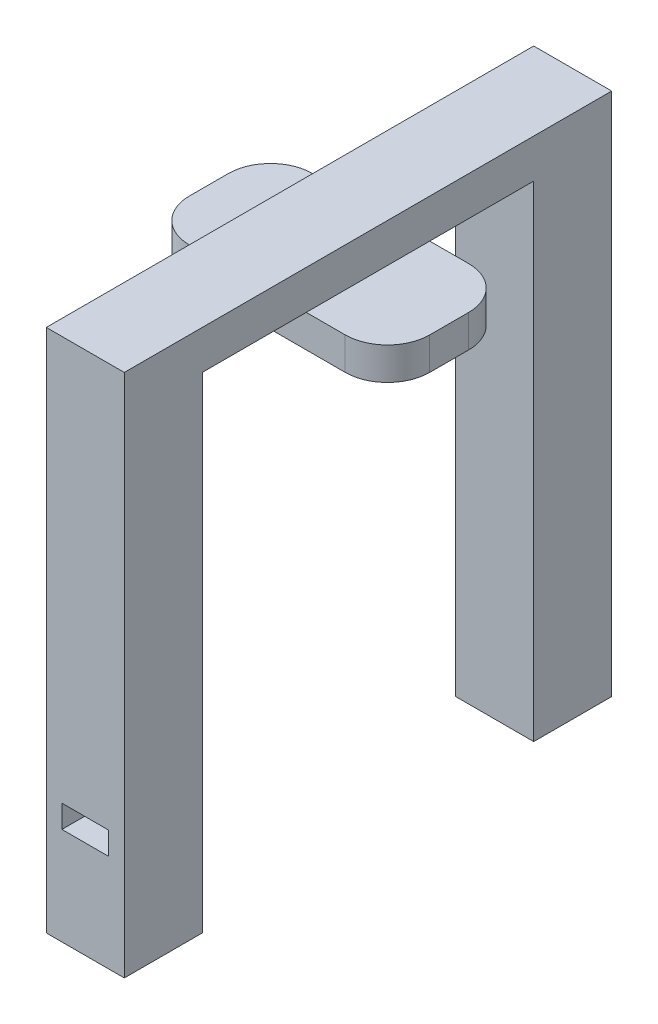
ISO-10303-21;
HEADER;
FILE_DESCRIPTION(('STEP AP214'),'2;1');
FILE_NAME('part.step','',(''),(''),'','','');
FILE_SCHEMA(('AUTOMOTIVE_DESIGN { 1 0 10303 214 1 1 1 1 }'));
ENDSEC;
DATA;
#1=APPLICATION_CONTEXT('core data for automotive mechanical design processes');
#2=APPLICATION_PROTOCOL_DEFINITION('international standard','automotive_design',2000,#1);
#3=PRODUCT_CONTEXT('',#1,'mechanical');
#4=PRODUCT('Part','Part','',(#3));
#5=PRODUCT_RELATED_PRODUCT_CATEGORY('part','',(#4));
#6=PRODUCT_DEFINITION_FORMATION('','',#4);
#7=PRODUCT_DEFINITION_CONTEXT('part definition',#1,'design');
#8=PRODUCT_DEFINITION('design','',#6,#7);
#9=PRODUCT_DEFINITION_SHAPE('','',#8);
#10=(LENGTH_UNIT() NAMED_UNIT(*) SI_UNIT(.MILLI.,.METRE.));
#11=(NAMED_UNIT(*) PLANE_ANGLE_UNIT() SI_UNIT($,.RADIAN.));
#12=(NAMED_UNIT(*) SI_UNIT($,.STERADIAN.) SOLID_ANGLE_UNIT());
#13=UNCERTAINTY_MEASURE_WITH_UNIT(LENGTH_MEASURE(1.E-05),#10,'distance_accuracy_value','');
#14=(GEOMETRIC_REPRESENTATION_CONTEXT(3) GLOBAL_UNCERTAINTY_ASSIGNED_CONTEXT((#13)) GLOBAL_UNIT_ASSIGNED_CONTEXT((#10,
#11,#12)) REPRESENTATION_CONTEXT('',''));
#15=CARTESIAN_POINT('',(0.,0.,0.));
#16=DIRECTION('',(0.,0.,1.));
#17=DIRECTION('',(1.,0.,0.));
#18=AXIS2_PLACEMENT_3D('',#15,#16,#17);
#19=CARTESIAN_POINT('',(-4.86740694674023,-29.7,-33.4324410330826));
#20=DIRECTION('',(0.,-1.,0.));
#21=DIRECTION('',(0.,0.,-1.));
#22=AXIS2_PLACEMENT_3D('',#19,#20,#21);
#23=CYLINDRICAL_SURFACE('',#22,2.075);
#24=CARTESIAN_POINT('',(-4.86740694674023,-69.7,-33.4324410330826));
#25=DIRECTION('',(0.,-1.,0.));
#26=DIRECTION('',(0.,0.,-1.));
#27=AXIS2_PLACEMENT_3D('',#24,#25,#26);
#28=CIRCLE('',#27,2.075);
#29=CARTESIAN_POINT('',(-4.86740694674023,-69.7,-35.5074410330826));
#30=VERTEX_POINT('',#29);
#31=EDGE_CURVE('E277',#30,#30,#28,.T.);
#32=ORIENTED_EDGE('',*,*,#31,.T.);
#33=EDGE_LOOP('',(#32));
#34=FACE_BOUND('',#33,.T.);
#35=CARTESIAN_POINT('',(-4.86740694674023,-54.7,-33.4324410330826));
#36=DIRECTION('',(0.,1.,0.));
#37=DIRECTION('',(0.,0.,1.));
#38=AXIS2_PLACEMENT_3D('',#35,#36,#37);
#39=CIRCLE('',#38,2.075);
#40=CARTESIAN_POINT('',(-4.86740694674023,-54.7,-31.3574410330826));
#41=VERTEX_POINT('',#40);
#42=EDGE_CURVE('E37',#41,#41,#39,.F.);
#43=ORIENTED_EDGE('',*,*,#42,.F.);
#44=EDGE_LOOP('',(#43));
#45=FACE_BOUND('',#44,.T.);
#46=ADVANCED_FACE('F33',(#34,#45),#23,.F.);
#47=CARTESIAN_POINT('',(-4.86740694674023,-29.7,29.5675589669174));
#48=DIRECTION('',(0.,-1.,0.));
#49=DIRECTION('',(0.,0.,-1.));
#50=AXIS2_PLACEMENT_3D('',#47,#48,#49);
#51=CYLINDRICAL_SURFACE('',#50,2.075);
#52=CARTESIAN_POINT('',(-4.86740694674023,-69.7,29.5675589669174));
#53=DIRECTION('',(0.,-1.,0.));
#54=DIRECTION('',(0.,0.,-1.));
#55=AXIS2_PLACEMENT_3D('',#52,#53,#54);
#56=CIRCLE('',#55,2.075);
#57=CARTESIAN_POINT('',(-4.86740694674023,-69.7,27.4925589669174));
#58=VERTEX_POINT('',#57);
#59=EDGE_CURVE('E280',#58,#58,#56,.T.);
#60=ORIENTED_EDGE('',*,*,#59,.T.);
#61=EDGE_LOOP('',(#60));
#62=FACE_BOUND('',#61,.T.);
#63=CARTESIAN_POINT('',(-4.86740694674023,-54.7,29.5675589669174));
#64=DIRECTION('',(0.,1.,0.));
#65=DIRECTION('',(0.,0.,1.));
#66=AXIS2_PLACEMENT_3D('',#63,#64,#65);
#67=CIRCLE('',#66,2.075);
#68=CARTESIAN_POINT('',(-4.86740694674023,-54.7,31.6425589669174));
#69=VERTEX_POINT('',#68);
#70=EDGE_CURVE('E284',#69,#69,#67,.F.);
#71=ORIENTED_EDGE('',*,*,#70,.F.);
#72=EDGE_LOOP('',(#71));
#73=FACE_BOUND('',#72,.T.);
#74=ADVANCED_FACE('F429',(#62,#73),#51,.F.);
#75=CARTESIAN_POINT('',(0.,5.,0.));
#76=DIRECTION('',(0.,1.,0.));
#77=DIRECTION('',(0.,0.,1.));
#78=AXIS2_PLACEMENT_3D('',#75,#76,#77);
#79=PLANE('',#78);
#80=DIRECTION('',(-1.,0.,0.));
#81=VECTOR('',#80,1.);
#82=CARTESIAN_POINT('',(0.,5.,-27.4324410330826));
#83=LINE('',#82,#81);
#84=CARTESIAN_POINT('',(1.13259305325977,5.,-27.4324410330826));
#85=VERTEX_POINT('',#84);
#86=CARTESIAN_POINT('',(-10.8674069467402,5.,-27.4324410330826));
#87=VERTEX_POINT('',#86);
#88=EDGE_CURVE('E300',#85,#87,#83,.T.);
#89=ORIENTED_EDGE('',*,*,#88,.F.);
#90=DIRECTION('',(0.,0.,-1.));
#91=VECTOR('',#90,1.);
#92=CARTESIAN_POINT('',(1.13259305325977,5.,35.5675589669174));
#93=LINE('',#92,#91);
#94=CARTESIAN_POINT('',(1.13259305325977,5.,-11.4324410330826));
#95=VERTEX_POINT('',#94);
#96=EDGE_CURVE('E330',#95,#85,#93,.T.);
#97=ORIENTED_EDGE('',*,*,#96,.F.);
#98=DIRECTION('',(-1.,0.,0.));
#99=VECTOR('',#98,1.);
#100=CARTESIAN_POINT('',(-23.3674069467402,5.,-11.4324410330826));
#101=LINE('',#100,#99);
#102=CARTESIAN_POINT('',(-10.8674069467402,5.,-11.4324410330826));
#103=VERTEX_POINT('',#102);
#104=EDGE_CURVE('E369',#95,#103,#101,.T.);
#105=ORIENTED_EDGE('',*,*,#104,.T.);
#106=DIRECTION('',(0.,0.,-1.));
#107=VECTOR('',#106,1.);
#108=CARTESIAN_POINT('',(-10.8674069467402,5.,35.5675589669174));
#109=LINE('',#108,#107);
#110=EDGE_CURVE('E45',#103,#87,#109,.T.);
#111=ORIENTED_EDGE('',*,*,#110,.T.);
#112=EDGE_LOOP('',(#89,#97,#105,#111));
#113=FACE_BOUND('',#112,.T.);
#114=ADVANCED_FACE('F437',(#113),#79,.F.);
#115=CARTESIAN_POINT('',(0.,5.,0.));
#116=DIRECTION('',(0.,1.,0.));
#117=DIRECTION('',(0.,0.,1.));
#118=AXIS2_PLACEMENT_3D('',#115,#116,#117);
#119=PLANE('',#118);
#120=DIRECTION('',(1.,0.,0.));
#121=VECTOR('',#120,1.);
#122=CARTESIAN_POINT('',(-23.3674069467402,5.,7.56755896691743));
#123=LINE('',#122,#121);
#124=CARTESIAN_POINT('',(-16.8674069467402,5.,7.56755896691743));
#125=VERTEX_POINT('',#124);
#126=CARTESIAN_POINT('',(-10.8674069467402,5.,7.56755896691743));
#127=VERTEX_POINT('',#126);
#128=EDGE_CURVE('E358',#125,#127,#123,.T.);
#129=ORIENTED_EDGE('',*,*,#128,.T.);
#130=EDGE_CURVE('E11',#127,#103,#109,.T.);
#131=ORIENTED_EDGE('',*,*,#130,.T.);
#132=CARTESIAN_POINT('',(-16.8674069467402,5.,-11.4324410330826));
#133=VERTEX_POINT('',#132);
#134=EDGE_CURVE('E365',#103,#133,#101,.T.);
#135=ORIENTED_EDGE('',*,*,#134,.T.);
#136=CARTESIAN_POINT('',(-16.8674069467402,5.,-4.93244103308257));
#137=DIRECTION('',(0.,1.,0.));
#138=DIRECTION('',(0.,0.,1.));
#139=AXIS2_PLACEMENT_3D('',#136,#137,#138);
#140=CIRCLE('',#139,6.5);
#141=CARTESIAN_POINT('',(-23.3674069467402,5.,-4.93244103308256));
#142=VERTEX_POINT('',#141);
#143=EDGE_CURVE('E404',#133,#142,#140,.T.);
#144=ORIENTED_EDGE('',*,*,#143,.T.);
#145=DIRECTION('',(0.,0.,1.));
#146=VECTOR('',#145,1.);
#147=CARTESIAN_POINT('',(-23.3674069467402,5.,-11.4324410330826));
#148=LINE('',#147,#146);
#149=CARTESIAN_POINT('',(-23.3674069467402,5.,1.06755896691744));
#150=VERTEX_POINT('',#149);
#151=EDGE_CURVE('E353',#142,#150,#148,.T.);
#152=ORIENTED_EDGE('',*,*,#151,.T.);
#153=CARTESIAN_POINT('',(-16.8674069467402,5.,1.06755896691743));
#154=DIRECTION('',(0.,1.,0.));
#155=DIRECTION('',(0.,0.,1.));
#156=AXIS2_PLACEMENT_3D('',#153,#154,#155);
#157=CIRCLE('',#156,6.5);
#158=EDGE_CURVE('E398',#150,#125,#157,.T.);
#159=ORIENTED_EDGE('',*,*,#158,.T.);
#160=EDGE_LOOP('',(#129,#131,#135,#144,#152,#159));
#161=FACE_BOUND('',#160,.T.);
#162=ADVANCED_FACE('F488',(#161),#119,.T.);
#163=CARTESIAN_POINT('',(-23.3674069467402,5.,-11.4324410330826));
#164=DIRECTION('',(1.,0.,0.));
#165=DIRECTION('',(0.,0.,-1.));
#166=AXIS2_PLACEMENT_3D('',#163,#164,#165);
#167=PLANE('',#166);
#168=ORIENTED_EDGE('',*,*,#151,.F.);
#169=DIRECTION('',(0.,-1.,0.));
#170=VECTOR('',#169,1.);
#171=CARTESIAN_POINT('',(-23.3674069467402,5.,-4.93244103308256));
#172=LINE('',#171,#170);
#173=CARTESIAN_POINT('',(-23.3674069467402,0.,-4.93244103308256));
#174=VERTEX_POINT('',#173);
#175=EDGE_CURVE('E381',#142,#174,#172,.T.);
#176=ORIENTED_EDGE('',*,*,#175,.T.);
#177=DIRECTION('',(0.,0.,1.));
#178=VECTOR('',#177,1.);
#179=CARTESIAN_POINT('',(-23.3674069467402,0.,-11.4324410330826));
#180=LINE('',#179,#178);
#181=CARTESIAN_POINT('',(-23.3674069467402,0.,1.06755896691744));
#182=VERTEX_POINT('',#181);
#183=EDGE_CURVE('E352',#174,#182,#180,.T.);
#184=ORIENTED_EDGE('',*,*,#183,.T.);
#185=DIRECTION('',(0.,-1.,0.));
#186=VECTOR('',#185,1.);
#187=CARTESIAN_POINT('',(-23.3674069467402,5.,1.06755896691744));
#188=LINE('',#187,#186);
#189=EDGE_CURVE('E368',#182,#150,#188,.F.);
#190=ORIENTED_EDGE('',*,*,#189,.T.);
#191=EDGE_LOOP('',(#168,#176,#184,#190));
#192=FACE_BOUND('',#191,.T.);
#193=ADVANCED_FACE('F526',(#192),#167,.F.);
#194=CARTESIAN_POINT('',(-23.3674069467402,5.,7.56755896691743));
#195=DIRECTION('',(0.,0.,-1.));
#196=DIRECTION('',(-1.,0.,0.));
#197=AXIS2_PLACEMENT_3D('',#194,#195,#196);
#198=PLANE('',#197);
#199=DIRECTION('',(1.,0.,0.));
#200=VECTOR('',#199,1.);
#201=CARTESIAN_POINT('',(-23.3674069467402,0.,7.56755896691743));
#202=LINE('',#201,#200);
#203=CARTESIAN_POINT('',(-16.8674069467402,0.,7.56755896691743));
#204=VERTEX_POINT('',#203);
#205=CARTESIAN_POINT('',(7.13259305325977,0.,7.56755896691743));
#206=VERTEX_POINT('',#205);
#207=EDGE_CURVE('E372',#204,#206,#202,.T.);
#208=ORIENTED_EDGE('',*,*,#207,.T.);
#209=DIRECTION('',(0.,-1.,0.));
#210=VECTOR('',#209,1.);
#211=CARTESIAN_POINT('',(7.13259305325977,5.,7.56755896691743));
#212=LINE('',#211,#210);
#213=CARTESIAN_POINT('',(7.13259305325977,5.,7.56755896691743));
#214=VERTEX_POINT('',#213);
#215=EDGE_CURVE('E414',#206,#214,#212,.F.);
#216=ORIENTED_EDGE('',*,*,#215,.T.);
#217=CARTESIAN_POINT('',(1.13259305325977,5.,7.56755896691743));
#218=VERTEX_POINT('',#217);
#219=EDGE_CURVE('E356',#218,#214,#123,.T.);
#220=ORIENTED_EDGE('',*,*,#219,.F.);
#221=EDGE_CURVE('E362',#127,#218,#123,.T.);
#222=ORIENTED_EDGE('',*,*,#221,.F.);
#223=ORIENTED_EDGE('',*,*,#128,.F.);
#224=DIRECTION('',(0.,-1.,0.));
#225=VECTOR('',#224,1.);
#226=CARTESIAN_POINT('',(-16.8674069467402,5.,7.56755896691743));
#227=LINE('',#226,#225);
#228=EDGE_CURVE('E411',#125,#204,#227,.T.);
#229=ORIENTED_EDGE('',*,*,#228,.T.);
#230=EDGE_LOOP('',(#208,#216,#220,#222,#223,#229));
#231=FACE_BOUND('',#230,.T.);
#232=ADVANCED_FACE('F522',(#231),#198,.F.);
#233=CARTESIAN_POINT('',(13.6325930532598,5.,-11.4324410330826));
#234=DIRECTION('',(-1.,0.,0.));
#235=DIRECTION('',(0.,0.,1.));
#236=AXIS2_PLACEMENT_3D('',#233,#234,#235);
#237=PLANE('',#236);
#238=DIRECTION('',(0.,0.,-1.));
#239=VECTOR('',#238,1.);
#240=CARTESIAN_POINT('',(13.6325930532598,0.,-11.4324410330826));
#241=LINE('',#240,#239);
#242=CARTESIAN_POINT('',(13.6325930532598,0.,1.06755896691743));
#243=VERTEX_POINT('',#242);
#244=CARTESIAN_POINT('',(13.6325930532598,0.,-4.93244103308256));
#245=VERTEX_POINT('',#244);
#246=EDGE_CURVE('E375',#243,#245,#241,.T.);
#247=ORIENTED_EDGE('',*,*,#246,.T.);
#248=DIRECTION('',(0.,-1.,0.));
#249=VECTOR('',#248,1.);
#250=CARTESIAN_POINT('',(13.6325930532598,5.,-4.93244103308256));
#251=LINE('',#250,#249);
#252=CARTESIAN_POINT('',(13.6325930532598,5.,-4.93244103308256));
#253=VERTEX_POINT('',#252);
#254=EDGE_CURVE('E409',#245,#253,#251,.F.);
#255=ORIENTED_EDGE('',*,*,#254,.T.);
#256=DIRECTION('',(0.,0.,-1.));
#257=VECTOR('',#256,1.);
#258=CARTESIAN_POINT('',(13.6325930532598,5.,-11.4324410330826));
#259=LINE('',#258,#257);
#260=CARTESIAN_POINT('',(13.6325930532598,5.,1.06755896691743));
#261=VERTEX_POINT('',#260);
#262=EDGE_CURVE('E361',#261,#253,#259,.T.);
#263=ORIENTED_EDGE('',*,*,#262,.F.);
#264=DIRECTION('',(0.,-1.,0.));
#265=VECTOR('',#264,1.);
#266=CARTESIAN_POINT('',(13.6325930532598,5.,1.06755896691743));
#267=LINE('',#266,#265);
#268=EDGE_CURVE('E406',#261,#243,#267,.T.);
#269=ORIENTED_EDGE('',*,*,#268,.T.);
#270=EDGE_LOOP('',(#247,#255,#263,#269));
#271=FACE_BOUND('',#270,.T.);
#272=ADVANCED_FACE('F518',(#271),#237,.F.);
#273=CARTESIAN_POINT('',(-23.3674069467402,5.,-11.4324410330826));
#274=DIRECTION('',(0.,0.,1.));
#275=DIRECTION('',(1.,0.,0.));
#276=AXIS2_PLACEMENT_3D('',#273,#274,#275);
#277=PLANE('',#276);
#278=DIRECTION('',(-1.,0.,0.));
#279=VECTOR('',#278,1.);
#280=CARTESIAN_POINT('',(-23.3674069467402,0.,-11.4324410330826));
#281=LINE('',#280,#279);
#282=CARTESIAN_POINT('',(7.13259305325978,0.,-11.4324410330826));
#283=VERTEX_POINT('',#282);
#284=CARTESIAN_POINT('',(-16.8674069467402,0.,-11.4324410330826));
#285=VERTEX_POINT('',#284);
#286=EDGE_CURVE('E357',#283,#285,#281,.T.);
#287=ORIENTED_EDGE('',*,*,#286,.T.);
#288=DIRECTION('',(0.,-1.,0.));
#289=VECTOR('',#288,1.);
#290=CARTESIAN_POINT('',(-16.8674069467402,5.,-11.4324410330826));
#291=LINE('',#290,#289);
#292=EDGE_CURVE('E395',#285,#133,#291,.F.);
#293=ORIENTED_EDGE('',*,*,#292,.T.);
#294=ORIENTED_EDGE('',*,*,#134,.F.);
#295=ORIENTED_EDGE('',*,*,#104,.F.);
#296=CARTESIAN_POINT('',(7.13259305325978,5.,-11.4324410330826));
#297=VERTEX_POINT('',#296);
#298=EDGE_CURVE('E366',#297,#95,#101,.T.);
#299=ORIENTED_EDGE('',*,*,#298,.F.);
#300=DIRECTION('',(0.,-1.,0.));
#301=VECTOR('',#300,1.);
#302=CARTESIAN_POINT('',(7.13259305325978,5.,-11.4324410330826));
#303=LINE('',#302,#301);
#304=EDGE_CURVE('E392',#297,#283,#303,.T.);
#305=ORIENTED_EDGE('',*,*,#304,.T.);
#306=EDGE_LOOP('',(#287,#293,#294,#295,#299,#305));
#307=FACE_BOUND('',#306,.T.);
#308=ADVANCED_FACE('F510',(#307),#277,.F.);
#309=EDGE_CURVE('E42',#218,#95,#93,.T.);
#310=ORIENTED_EDGE('',*,*,#309,.F.);
#311=ORIENTED_EDGE('',*,*,#219,.T.);
#312=CARTESIAN_POINT('',(7.13259305325977,5.,1.06755896691743));
#313=DIRECTION('',(0.,1.,0.));
#314=DIRECTION('',(0.,0.,1.));
#315=AXIS2_PLACEMENT_3D('',#312,#313,#314);
#316=CIRCLE('',#315,6.5);
#317=EDGE_CURVE('E400',#214,#261,#316,.T.);
#318=ORIENTED_EDGE('',*,*,#317,.T.);
#319=ORIENTED_EDGE('',*,*,#262,.T.);
#320=CARTESIAN_POINT('',(7.13259305325978,5.,-4.93244103308257));
#321=DIRECTION('',(0.,1.,0.));
#322=DIRECTION('',(0.,0.,1.));
#323=AXIS2_PLACEMENT_3D('',#320,#321,#322);
#324=CIRCLE('',#323,6.5);
#325=EDGE_CURVE('E402',#253,#297,#324,.T.);
#326=ORIENTED_EDGE('',*,*,#325,.T.);
#327=ORIENTED_EDGE('',*,*,#298,.T.);
#328=EDGE_LOOP('',(#310,#311,#318,#319,#326,#327));
#329=FACE_BOUND('',#328,.T.);
#330=ADVANCED_FACE('F506',(#329),#119,.T.);
#331=CARTESIAN_POINT('',(0.,0.,0.));
#332=DIRECTION('',(0.,1.,0.));
#333=DIRECTION('',(0.,0.,1.));
#334=AXIS2_PLACEMENT_3D('',#331,#332,#333);
#335=PLANE('',#334);
#336=ORIENTED_EDGE('',*,*,#183,.F.);
#337=CARTESIAN_POINT('',(-16.8674069467402,0.,-4.93244103308257));
#338=DIRECTION('',(0.,1.,0.));
#339=DIRECTION('',(0.,0.,1.));
#340=AXIS2_PLACEMENT_3D('',#337,#338,#339);
#341=CIRCLE('',#340,6.5);
#342=EDGE_CURVE('E390',#174,#285,#341,.F.);
#343=ORIENTED_EDGE('',*,*,#342,.T.);
#344=ORIENTED_EDGE('',*,*,#286,.F.);
#345=CARTESIAN_POINT('',(7.13259305325978,0.,-4.93244103308257));
#346=DIRECTION('',(0.,1.,0.));
#347=DIRECTION('',(0.,0.,1.));
#348=AXIS2_PLACEMENT_3D('',#345,#346,#347);
#349=CIRCLE('',#348,6.5);
#350=EDGE_CURVE('E388',#283,#245,#349,.F.);
#351=ORIENTED_EDGE('',*,*,#350,.T.);
#352=ORIENTED_EDGE('',*,*,#246,.F.);
#353=CARTESIAN_POINT('',(7.13259305325977,0.,1.06755896691743));
#354=DIRECTION('',(0.,1.,0.));
#355=DIRECTION('',(0.,0.,1.));
#356=AXIS2_PLACEMENT_3D('',#353,#354,#355);
#357=CIRCLE('',#356,6.5);
#358=EDGE_CURVE('E386',#243,#206,#357,.F.);
#359=ORIENTED_EDGE('',*,*,#358,.T.);
#360=ORIENTED_EDGE('',*,*,#207,.F.);
#361=CARTESIAN_POINT('',(-16.8674069467402,0.,1.06755896691743));
#362=DIRECTION('',(0.,1.,0.));
#363=DIRECTION('',(0.,0.,1.));
#364=AXIS2_PLACEMENT_3D('',#361,#362,#363);
#365=CIRCLE('',#364,6.5);
#366=EDGE_CURVE('E384',#204,#182,#365,.F.);
#367=ORIENTED_EDGE('',*,*,#366,.T.);
#368=EDGE_LOOP('',(#336,#343,#344,#351,#352,#359,#360,#367));
#369=FACE_BOUND('',#368,.T.);
#370=ADVANCED_FACE('F509',(#369),#335,.F.);
#371=CARTESIAN_POINT('',(-16.8674069467402,5.,-4.93244103308257));
#372=DIRECTION('',(0.,-1.,0.));
#373=DIRECTION('',(0.,0.,-1.));
#374=AXIS2_PLACEMENT_3D('',#371,#372,#373);
#375=CYLINDRICAL_SURFACE('',#374,6.5);
#376=ORIENTED_EDGE('',*,*,#143,.F.);
#377=ORIENTED_EDGE('',*,*,#292,.F.);
#378=ORIENTED_EDGE('',*,*,#342,.F.);
#379=ORIENTED_EDGE('',*,*,#175,.F.);
#380=EDGE_LOOP('',(#376,#377,#378,#379));
#381=FACE_BOUND('',#380,.T.);
#382=ADVANCED_FACE('F514',(#381),#375,.T.);
#383=CARTESIAN_POINT('',(7.13259305325978,5.,-4.93244103308257));
#384=DIRECTION('',(0.,-1.,0.));
#385=DIRECTION('',(0.,0.,-1.));
#386=AXIS2_PLACEMENT_3D('',#383,#384,#385);
#387=CYLINDRICAL_SURFACE('',#386,6.5);
#388=ORIENTED_EDGE('',*,*,#325,.F.);
#389=ORIENTED_EDGE('',*,*,#254,.F.);
#390=ORIENTED_EDGE('',*,*,#350,.F.);
#391=ORIENTED_EDGE('',*,*,#304,.F.);
#392=EDGE_LOOP('',(#388,#389,#390,#391));
#393=FACE_BOUND('',#392,.T.);
#394=ADVANCED_FACE('F533',(#393),#387,.T.);
#395=CARTESIAN_POINT('',(7.13259305325977,5.,1.06755896691743));
#396=DIRECTION('',(0.,-1.,0.));
#397=DIRECTION('',(0.,0.,-1.));
#398=AXIS2_PLACEMENT_3D('',#395,#396,#397);
#399=CYLINDRICAL_SURFACE('',#398,6.5);
#400=ORIENTED_EDGE('',*,*,#317,.F.);
#401=ORIENTED_EDGE('',*,*,#215,.F.);
#402=ORIENTED_EDGE('',*,*,#358,.F.);
#403=ORIENTED_EDGE('',*,*,#268,.F.);
#404=EDGE_LOOP('',(#400,#401,#402,#403));
#405=FACE_BOUND('',#404,.T.);
#406=ADVANCED_FACE('F536',(#405),#399,.T.);
#407=CARTESIAN_POINT('',(-16.8674069467402,5.,1.06755896691743));
#408=DIRECTION('',(0.,-1.,0.));
#409=DIRECTION('',(0.,0.,-1.));
#410=AXIS2_PLACEMENT_3D('',#407,#408,#409);
#411=CYLINDRICAL_SURFACE('',#410,6.5);
#412=ORIENTED_EDGE('',*,*,#158,.F.);
#413=ORIENTED_EDGE('',*,*,#189,.F.);
#414=ORIENTED_EDGE('',*,*,#366,.F.);
#415=ORIENTED_EDGE('',*,*,#228,.F.);
#416=EDGE_LOOP('',(#412,#413,#414,#415));
#417=FACE_BOUND('',#416,.T.);
#418=ADVANCED_FACE('F35',(#417),#411,.T.);
#419=CARTESIAN_POINT('',(1.13259305325977,5.,23.5675589669174));
#420=VERTEX_POINT('',#419);
#421=EDGE_CURVE('E343',#420,#218,#93,.T.);
#422=ORIENTED_EDGE('',*,*,#421,.F.);
#423=DIRECTION('',(-1.,0.,0.));
#424=VECTOR('',#423,1.);
#425=CARTESIAN_POINT('',(1.13259305325977,5.,23.5675589669174));
#426=LINE('',#425,#424);
#427=CARTESIAN_POINT('',(-10.8674069467402,5.,23.5675589669174));
#428=VERTEX_POINT('',#427);
#429=EDGE_CURVE('E297',#420,#428,#426,.T.);
#430=ORIENTED_EDGE('',*,*,#429,.T.);
#431=EDGE_CURVE('E44',#428,#127,#109,.T.);
#432=ORIENTED_EDGE('',*,*,#431,.T.);
#433=ORIENTED_EDGE('',*,*,#221,.T.);
#434=EDGE_LOOP('',(#422,#430,#432,#433));
#435=FACE_BOUND('',#434,.T.);
#436=ADVANCED_FACE('F490',(#435),#79,.F.);
#437=CARTESIAN_POINT('',(-10.8674069467402,11.,35.5675589669174));
#438=DIRECTION('',(0.,0.,-1.));
#439=DIRECTION('',(-1.,0.,0.));
#440=AXIS2_PLACEMENT_3D('',#437,#438,#439);
#441=PLANE('',#440);
#442=DIRECTION('',(-1.,0.,0.));
#443=VECTOR('',#442,1.);
#444=CARTESIAN_POINT('',(-1.26740694674023,-51.2,35.5675589669174));
#445=LINE('',#444,#443);
#446=CARTESIAN_POINT('',(-1.26740694674023,-51.2,35.5675589669174));
#447=VERTEX_POINT('',#446);
#448=CARTESIAN_POINT('',(-8.46740694674023,-51.2,35.5675589669174));
#449=VERTEX_POINT('',#448);
#450=EDGE_CURVE('E261',#447,#449,#445,.T.);
#451=ORIENTED_EDGE('',*,*,#450,.F.);
#452=DIRECTION('',(0.,1.,0.));
#453=VECTOR('',#452,1.);
#454=CARTESIAN_POINT('',(-1.26740694674023,-54.7,35.5675589669174));
#455=LINE('',#454,#453);
#456=CARTESIAN_POINT('',(-1.26740694674023,-54.7,35.5675589669174));
#457=VERTEX_POINT('',#456);
#458=EDGE_CURVE('E60',#457,#447,#455,.T.);
#459=ORIENTED_EDGE('',*,*,#458,.F.);
#460=DIRECTION('',(-1.,0.,0.));
#461=VECTOR('',#460,1.);
#462=CARTESIAN_POINT('',(-1.26740694674023,-54.7,35.5675589669174));
#463=LINE('',#462,#461);
#464=CARTESIAN_POINT('',(-8.46740694674023,-54.7,35.5675589669174));
#465=VERTEX_POINT('',#464);
#466=EDGE_CURVE('E252',#457,#465,#463,.T.);
#467=ORIENTED_EDGE('',*,*,#466,.T.);
#468=DIRECTION('',(0.,1.,0.));
#469=VECTOR('',#468,1.);
#470=CARTESIAN_POINT('',(-8.46740694674023,-54.7,35.5675589669174));
#471=LINE('',#470,#469);
#472=EDGE_CURVE('E264',#465,#449,#471,.T.);
#473=ORIENTED_EDGE('',*,*,#472,.T.);
#474=EDGE_LOOP('',(#451,#459,#467,#473));
#475=FACE_BOUND('',#474,.T.);
#476=DIRECTION('',(0.,-1.,0.));
#477=VECTOR('',#476,1.);
#478=CARTESIAN_POINT('',(-10.8674069467402,11.,35.5675589669174));
#479=LINE('',#478,#477);
#480=CARTESIAN_POINT('',(-10.8674069467402,11.,35.5675589669174));
#481=VERTEX_POINT('',#480);
#482=CARTESIAN_POINT('',(-10.8674069467402,-69.7,35.5675589669174));
#483=VERTEX_POINT('',#482);
#484=EDGE_CURVE('E342',#481,#483,#479,.T.);
#485=ORIENTED_EDGE('',*,*,#484,.T.);
#486=DIRECTION('',(-1.,0.,0.));
#487=VECTOR('',#486,1.);
#488=CARTESIAN_POINT('',(1.13259305325977,-69.7,35.5675589669174));
#489=LINE('',#488,#487);
#490=CARTESIAN_POINT('',(1.13259305325977,-69.7,35.5675589669174));
#491=VERTEX_POINT('',#490);
#492=EDGE_CURVE('E294',#491,#483,#489,.T.);
#493=ORIENTED_EDGE('',*,*,#492,.F.);
#494=DIRECTION('',(0.,-1.,0.));
#495=VECTOR('',#494,1.);
#496=CARTESIAN_POINT('',(1.13259305325977,11.,35.5675589669174));
#497=LINE('',#496,#495);
#498=CARTESIAN_POINT('',(1.13259305325977,11.,35.5675589669174));
#499=VERTEX_POINT('',#498);
#500=EDGE_CURVE('E350',#499,#491,#497,.T.);
#501=ORIENTED_EDGE('',*,*,#500,.F.);
#502=DIRECTION('',(1.,0.,0.));
#503=VECTOR('',#502,1.);
#504=CARTESIAN_POINT('',(-10.8674069467402,11.,35.5675589669174));
#505=LINE('',#504,#503);
#506=EDGE_CURVE('E331',#481,#499,#505,.T.);
#507=ORIENTED_EDGE('',*,*,#506,.F.);
#508=EDGE_LOOP('',(#485,#493,#501,#507));
#509=FACE_BOUND('',#508,.T.);
#510=ADVANCED_FACE('F501',(#475,#509),#441,.F.);
#511=CARTESIAN_POINT('',(1.13259305325977,11.,35.5675589669174));
#512=DIRECTION('',(-1.,0.,0.));
#513=DIRECTION('',(0.,0.,1.));
#514=AXIS2_PLACEMENT_3D('',#511,#512,#513);
#515=PLANE('',#514);
#516=ORIENTED_EDGE('',*,*,#500,.T.);
#517=DIRECTION('',(0.,0.,-1.));
#518=VECTOR('',#517,1.);
#519=CARTESIAN_POINT('',(1.13259305325977,-69.7,35.5675589669174));
#520=LINE('',#519,#518);
#521=CARTESIAN_POINT('',(1.13259305325977,-69.7,23.5675589669174));
#522=VERTEX_POINT('',#521);
#523=EDGE_CURVE('E301',#491,#522,#520,.T.);
#524=ORIENTED_EDGE('',*,*,#523,.T.);
#525=DIRECTION('',(0.,1.,0.));
#526=VECTOR('',#525,1.);
#527=CARTESIAN_POINT('',(1.13259305325977,-69.7,23.5675589669174));
#528=LINE('',#527,#526);
#529=EDGE_CURVE('E291',#522,#420,#528,.T.);
#530=ORIENTED_EDGE('',*,*,#529,.T.);
#531=ORIENTED_EDGE('',*,*,#421,.T.);
#532=ORIENTED_EDGE('',*,*,#309,.T.);
#533=ORIENTED_EDGE('',*,*,#96,.T.);
#534=DIRECTION('',(0.,1.,0.));
#535=VECTOR('',#534,1.);
#536=CARTESIAN_POINT('',(1.13259305325977,-69.7,-27.4324410330826));
#537=LINE('',#536,#535);
#538=CARTESIAN_POINT('',(1.13259305325977,-69.7,-27.4324410330826));
#539=VERTEX_POINT('',#538);
#540=EDGE_CURVE('E327',#539,#85,#537,.T.);
#541=ORIENTED_EDGE('',*,*,#540,.F.);
#542=DIRECTION('',(0.,0.,1.));
#543=VECTOR('',#542,1.);
#544=CARTESIAN_POINT('',(1.13259305325977,-69.7,0.));
#545=LINE('',#544,#543);
#546=CARTESIAN_POINT('',(1.13259305325977,-69.7,-39.4324410330826));
#547=VERTEX_POINT('',#546);
#548=EDGE_CURVE('E311',#547,#539,#545,.T.);
#549=ORIENTED_EDGE('',*,*,#548,.F.);
#550=DIRECTION('',(0.,-1.,0.));
#551=VECTOR('',#550,1.);
#552=CARTESIAN_POINT('',(1.13259305325977,11.,-39.4324410330826));
#553=LINE('',#552,#551);
#554=CARTESIAN_POINT('',(1.13259305325977,11.,-39.4324410330826));
#555=VERTEX_POINT('',#554);
#556=EDGE_CURVE('E348',#555,#547,#553,.T.);
#557=ORIENTED_EDGE('',*,*,#556,.F.);
#558=DIRECTION('',(0.,0.,-1.));
#559=VECTOR('',#558,1.);
#560=CARTESIAN_POINT('',(1.13259305325977,11.,35.5675589669174));
#561=LINE('',#560,#559);
#562=EDGE_CURVE('E334',#499,#555,#561,.T.);
#563=ORIENTED_EDGE('',*,*,#562,.F.);
#564=EDGE_LOOP('',(#516,#524,#530,#531,#532,#533,#541,#549,#557,#563));
#565=FACE_BOUND('',#564,.T.);
#566=ADVANCED_FACE('F497',(#565),#515,.F.);
#567=CARTESIAN_POINT('',(-10.8674069467402,11.,-39.4324410330826));
#568=DIRECTION('',(0.,0.,-1.));
#569=DIRECTION('',(-1.,0.,0.));
#570=AXIS2_PLACEMENT_3D('',#567,#568,#569);
#571=PLANE('',#570);
#572=DIRECTION('',(0.,1.,0.));
#573=VECTOR('',#572,1.);
#574=CARTESIAN_POINT('',(-8.46740694674023,-54.7,-39.4324410330826));
#575=LINE('',#574,#573);
#576=CARTESIAN_POINT('',(-8.46740694674023,-54.7,-39.4324410330826));
#577=VERTEX_POINT('',#576);
#578=CARTESIAN_POINT('',(-8.46740694674023,-51.2,-39.4324410330826));
#579=VERTEX_POINT('',#578);
#580=EDGE_CURVE('E52',#577,#579,#575,.T.);
#581=ORIENTED_EDGE('',*,*,#580,.F.);
#582=DIRECTION('',(1.,0.,0.));
#583=VECTOR('',#582,1.);
#584=CARTESIAN_POINT('',(-8.46740694674023,-54.7,-39.4324410330826));
#585=LINE('',#584,#583);
#586=CARTESIAN_POINT('',(-1.26740694674023,-54.7,-39.4324410330826));
#587=VERTEX_POINT('',#586);
#588=EDGE_CURVE('E229',#577,#587,#585,.T.);
#589=ORIENTED_EDGE('',*,*,#588,.T.);
#590=DIRECTION('',(0.,1.,0.));
#591=VECTOR('',#590,1.);
#592=CARTESIAN_POINT('',(-1.26740694674023,-54.7,-39.4324410330826));
#593=LINE('',#592,#591);
#594=CARTESIAN_POINT('',(-1.26740694674023,-51.2,-39.4324410330826));
#595=VERTEX_POINT('',#594);
#596=EDGE_CURVE('E232',#587,#595,#593,.T.);
#597=ORIENTED_EDGE('',*,*,#596,.T.);
#598=DIRECTION('',(1.,0.,0.));
#599=VECTOR('',#598,1.);
#600=CARTESIAN_POINT('',(-8.46740694674023,-51.2,-39.4324410330826));
#601=LINE('',#600,#599);
#602=EDGE_CURVE('E238',#579,#595,#601,.T.);
#603=ORIENTED_EDGE('',*,*,#602,.F.);
#604=EDGE_LOOP('',(#581,#589,#597,#603));
#605=FACE_BOUND('',#604,.T.);
#606=ORIENTED_EDGE('',*,*,#556,.T.);
#607=DIRECTION('',(1.,0.,0.));
#608=VECTOR('',#607,1.);
#609=CARTESIAN_POINT('',(0.,-69.7,-39.4324410330826));
#610=LINE('',#609,#608);
#611=CARTESIAN_POINT('',(-10.8674069467402,-69.7,-39.4324410330826));
#612=VERTEX_POINT('',#611);
#613=EDGE_CURVE('E319',#612,#547,#610,.T.);
#614=ORIENTED_EDGE('',*,*,#613,.F.);
#615=DIRECTION('',(0.,-1.,0.));
#616=VECTOR('',#615,1.);
#617=CARTESIAN_POINT('',(-10.8674069467402,11.,-39.4324410330826));
#618=LINE('',#617,#616);
#619=CARTESIAN_POINT('',(-10.8674069467402,11.,-39.4324410330826));
#620=VERTEX_POINT('',#619);
#621=EDGE_CURVE('E346',#620,#612,#618,.T.);
#622=ORIENTED_EDGE('',*,*,#621,.F.);
#623=DIRECTION('',(1.,0.,0.));
#624=VECTOR('',#623,1.);
#625=CARTESIAN_POINT('',(-10.8674069467402,11.,-39.4324410330826));
#626=LINE('',#625,#624);
#627=EDGE_CURVE('E336',#620,#555,#626,.T.);
#628=ORIENTED_EDGE('',*,*,#627,.T.);
#629=EDGE_LOOP('',(#606,#614,#622,#628));
#630=FACE_BOUND('',#629,.T.);
#631=ADVANCED_FACE('F493',(#605,#630),#571,.T.);
#632=CARTESIAN_POINT('',(-10.8674069467402,11.,35.5675589669174));
#633=DIRECTION('',(-1.,0.,0.));
#634=DIRECTION('',(0.,0.,1.));
#635=AXIS2_PLACEMENT_3D('',#632,#633,#634);
#636=PLANE('',#635);
#637=ORIENTED_EDGE('',*,*,#431,.F.);
#638=DIRECTION('',(0.,1.,0.));
#639=VECTOR('',#638,1.);
#640=CARTESIAN_POINT('',(-10.8674069467402,-69.7,23.5675589669174));
#641=LINE('',#640,#639);
#642=CARTESIAN_POINT('',(-10.8674069467402,-69.7,23.5675589669174));
#643=VERTEX_POINT('',#642);
#644=EDGE_CURVE('E288',#643,#428,#641,.T.);
#645=ORIENTED_EDGE('',*,*,#644,.F.);
#646=DIRECTION('',(0.,0.,-1.));
#647=VECTOR('',#646,1.);
#648=CARTESIAN_POINT('',(-10.8674069467402,-69.7,35.5675589669174));
#649=LINE('',#648,#647);
#650=EDGE_CURVE('E304',#483,#643,#649,.T.);
#651=ORIENTED_EDGE('',*,*,#650,.F.);
#652=ORIENTED_EDGE('',*,*,#484,.F.);
#653=DIRECTION('',(0.,0.,-1.));
#654=VECTOR('',#653,1.);
#655=CARTESIAN_POINT('',(-10.8674069467402,11.,35.5675589669174));
#656=LINE('',#655,#654);
#657=EDGE_CURVE('E339',#481,#620,#656,.T.);
#658=ORIENTED_EDGE('',*,*,#657,.T.);
#659=ORIENTED_EDGE('',*,*,#621,.T.);
#660=DIRECTION('',(0.,0.,-1.));
#661=VECTOR('',#660,1.);
#662=CARTESIAN_POINT('',(-10.8674069467402,-69.7,0.));
#663=LINE('',#662,#661);
#664=CARTESIAN_POINT('',(-10.8674069467402,-69.7,-27.4324410330826));
#665=VERTEX_POINT('',#664);
#666=EDGE_CURVE('E316',#665,#612,#663,.T.);
#667=ORIENTED_EDGE('',*,*,#666,.F.);
#668=DIRECTION('',(0.,1.,0.));
#669=VECTOR('',#668,1.);
#670=CARTESIAN_POINT('',(-10.8674069467402,-69.7,-27.4324410330826));
#671=LINE('',#670,#669);
#672=EDGE_CURVE('E322',#665,#87,#671,.T.);
#673=ORIENTED_EDGE('',*,*,#672,.T.);
#674=ORIENTED_EDGE('',*,*,#110,.F.);
#675=ORIENTED_EDGE('',*,*,#130,.F.);
#676=EDGE_LOOP('',(#637,#645,#651,#652,#658,#659,#667,#673,#674,#675));
#677=FACE_BOUND('',#676,.T.);
#678=ADVANCED_FACE('F484',(#677),#636,.T.);
#679=CARTESIAN_POINT('',(0.,11.,0.));
#680=DIRECTION('',(0.,1.,0.));
#681=DIRECTION('',(0.,0.,1.));
#682=AXIS2_PLACEMENT_3D('',#679,#680,#681);
#683=PLANE('',#682);
#684=ORIENTED_EDGE('',*,*,#506,.T.);
#685=ORIENTED_EDGE('',*,*,#562,.T.);
#686=ORIENTED_EDGE('',*,*,#627,.F.);
#687=ORIENTED_EDGE('',*,*,#657,.F.);
#688=EDGE_LOOP('',(#684,#685,#686,#687));
#689=FACE_BOUND('',#688,.T.);
#690=ADVANCED_FACE('F480',(#689),#683,.T.);
#691=CARTESIAN_POINT('',(0.,-69.7,-27.4324410330826));
#692=DIRECTION('',(0.,0.,-1.));
#693=DIRECTION('',(-1.,0.,0.));
#694=AXIS2_PLACEMENT_3D('',#691,#692,#693);
#695=PLANE('',#694);
#696=ORIENTED_EDGE('',*,*,#88,.T.);
#697=ORIENTED_EDGE('',*,*,#672,.F.);
#698=DIRECTION('',(-1.,0.,0.));
#699=VECTOR('',#698,1.);
#700=CARTESIAN_POINT('',(0.,-69.7,-27.4324410330826));
#701=LINE('',#700,#699);
#702=EDGE_CURVE('E314',#539,#665,#701,.T.);
#703=ORIENTED_EDGE('',*,*,#702,.F.);
#704=ORIENTED_EDGE('',*,*,#540,.T.);
#705=EDGE_LOOP('',(#696,#697,#703,#704));
#706=FACE_BOUND('',#705,.T.);
#707=ADVANCED_FACE('F476',(#706),#695,.F.);
#708=CARTESIAN_POINT('',(0.,-69.7,0.));
#709=DIRECTION('',(0.,-1.,0.));
#710=DIRECTION('',(0.,0.,-1.));
#711=AXIS2_PLACEMENT_3D('',#708,#709,#710);
#712=PLANE('',#711);
#713=ORIENTED_EDGE('',*,*,#31,.F.);
#714=EDGE_LOOP('',(#713));
#715=FACE_BOUND('',#714,.T.);
#716=ORIENTED_EDGE('',*,*,#548,.T.);
#717=ORIENTED_EDGE('',*,*,#702,.T.);
#718=ORIENTED_EDGE('',*,*,#666,.T.);
#719=ORIENTED_EDGE('',*,*,#613,.T.);
#720=EDGE_LOOP('',(#716,#717,#718,#719));
#721=FACE_BOUND('',#720,.T.);
#722=ADVANCED_FACE('F468',(#715,#721),#712,.T.);
#723=CARTESIAN_POINT('',(1.13259305325977,-69.7,23.5675589669174));
#724=DIRECTION('',(0.,0.,-1.));
#725=DIRECTION('',(-1.,0.,0.));
#726=AXIS2_PLACEMENT_3D('',#723,#724,#725);
#727=PLANE('',#726);
#728=ORIENTED_EDGE('',*,*,#429,.F.);
#729=ORIENTED_EDGE('',*,*,#529,.F.);
#730=DIRECTION('',(-1.,0.,0.));
#731=VECTOR('',#730,1.);
#732=CARTESIAN_POINT('',(1.13259305325977,-69.7,23.5675589669174));
#733=LINE('',#732,#731);
#734=EDGE_CURVE('E306',#522,#643,#733,.T.);
#735=ORIENTED_EDGE('',*,*,#734,.T.);
#736=ORIENTED_EDGE('',*,*,#644,.T.);
#737=EDGE_LOOP('',(#728,#729,#735,#736));
#738=FACE_BOUND('',#737,.T.);
#739=ADVANCED_FACE('F464',(#738),#727,.T.);
#740=CARTESIAN_POINT('',(0.,-69.7,0.));
#741=DIRECTION('',(0.,1.,0.));
#742=DIRECTION('',(0.,0.,1.));
#743=AXIS2_PLACEMENT_3D('',#740,#741,#742);
#744=PLANE('',#743);
#745=ORIENTED_EDGE('',*,*,#59,.F.);
#746=EDGE_LOOP('',(#745));
#747=FACE_BOUND('',#746,.T.);
#748=ORIENTED_EDGE('',*,*,#523,.F.);
#749=ORIENTED_EDGE('',*,*,#492,.T.);
#750=ORIENTED_EDGE('',*,*,#650,.T.);
#751=ORIENTED_EDGE('',*,*,#734,.F.);
#752=EDGE_LOOP('',(#748,#749,#750,#751));
#753=FACE_BOUND('',#752,.T.);
#754=ADVANCED_FACE('F467',(#747,#753),#744,.F.);
#755=CARTESIAN_POINT('',(-1.26740694674023,-54.7,25.3175589669174));
#756=DIRECTION('',(0.,1.,0.));
#757=DIRECTION('',(0.,0.,1.));
#758=AXIS2_PLACEMENT_3D('',#755,#756,#757);
#759=PLANE('',#758);
#760=ORIENTED_EDGE('',*,*,#466,.F.);
#761=DIRECTION('',(0.,0.,1.));
#762=VECTOR('',#761,1.);
#763=CARTESIAN_POINT('',(-1.26740694674023,-54.7,25.3175589669174));
#764=LINE('',#763,#762);
#765=CARTESIAN_POINT('',(-1.26740694674023,-54.7,25.3175589669174));
#766=VERTEX_POINT('',#765);
#767=EDGE_CURVE('E269',#766,#457,#764,.T.);
#768=ORIENTED_EDGE('',*,*,#767,.F.);
#769=DIRECTION('',(-1.,0.,0.));
#770=VECTOR('',#769,1.);
#771=CARTESIAN_POINT('',(-1.26740694674023,-54.7,25.3175589669174));
#772=LINE('',#771,#770);
#773=CARTESIAN_POINT('',(-8.46740694674023,-54.7,25.3175589669174));
#774=VERTEX_POINT('',#773);
#775=EDGE_CURVE('E257',#766,#774,#772,.T.);
#776=ORIENTED_EDGE('',*,*,#775,.T.);
#777=DIRECTION('',(0.,0.,1.));
#778=VECTOR('',#777,1.);
#779=CARTESIAN_POINT('',(-8.46740694674023,-54.7,25.3175589669174));
#780=LINE('',#779,#778);
#781=EDGE_CURVE('E272',#774,#465,#780,.T.);
#782=ORIENTED_EDGE('',*,*,#781,.T.);
#783=EDGE_LOOP('',(#760,#768,#776,#782));
#784=FACE_BOUND('',#783,.T.);
#785=ORIENTED_EDGE('',*,*,#70,.T.);
#786=EDGE_LOOP('',(#785));
#787=FACE_BOUND('',#786,.T.);
#788=ADVANCED_FACE('F472',(#784,#787),#759,.T.);
#789=CARTESIAN_POINT('',(-1.26740694674023,-51.2,25.3175589669174));
#790=DIRECTION('',(0.,1.,0.));
#791=DIRECTION('',(0.,0.,1.));
#792=AXIS2_PLACEMENT_3D('',#789,#790,#791);
#793=PLANE('',#792);
#794=ORIENTED_EDGE('',*,*,#450,.T.);
#795=DIRECTION('',(0.,0.,1.));
#796=VECTOR('',#795,1.);
#797=CARTESIAN_POINT('',(-8.46740694674023,-51.2,25.3175589669174));
#798=LINE('',#797,#796);
#799=CARTESIAN_POINT('',(-8.46740694674023,-51.2,25.3175589669174));
#800=VERTEX_POINT('',#799);
#801=EDGE_CURVE('E274',#800,#449,#798,.T.);
#802=ORIENTED_EDGE('',*,*,#801,.F.);
#803=DIRECTION('',(-1.,0.,0.));
#804=VECTOR('',#803,1.);
#805=CARTESIAN_POINT('',(-1.26740694674023,-51.2,25.3175589669174));
#806=LINE('',#805,#804);
#807=CARTESIAN_POINT('',(-1.26740694674023,-51.2,25.3175589669174));
#808=VERTEX_POINT('',#807);
#809=EDGE_CURVE('E251',#808,#800,#806,.T.);
#810=ORIENTED_EDGE('',*,*,#809,.F.);
#811=DIRECTION('',(0.,0.,1.));
#812=VECTOR('',#811,1.);
#813=CARTESIAN_POINT('',(-1.26740694674023,-51.2,25.3175589669174));
#814=LINE('',#813,#812);
#815=EDGE_CURVE('E259',#808,#447,#814,.T.);
#816=ORIENTED_EDGE('',*,*,#815,.T.);
#817=EDGE_LOOP('',(#794,#802,#810,#816));
#818=FACE_BOUND('',#817,.T.);
#819=CARTESIAN_POINT('',(-4.86740694674023,-51.2,29.5675589669174));
#820=DIRECTION('',(0.,1.,0.));
#821=DIRECTION('',(0.,0.,1.));
#822=AXIS2_PLACEMENT_3D('',#819,#820,#821);
#823=CIRCLE('',#822,2.075);
#824=CARTESIAN_POINT('',(-4.86740694674023,-51.2,31.6425589669174));
#825=VERTEX_POINT('',#824);
#826=EDGE_CURVE('E271',#825,#825,#823,.F.);
#827=ORIENTED_EDGE('',*,*,#826,.F.);
#828=EDGE_LOOP('',(#827));
#829=FACE_BOUND('',#828,.T.);
#830=ADVANCED_FACE('F711',(#818,#829),#793,.F.);
#831=CARTESIAN_POINT('',(-1.26740694674023,-54.7,25.3175589669174));
#832=DIRECTION('',(1.,0.,0.));
#833=DIRECTION('',(0.,0.,-1.));
#834=AXIS2_PLACEMENT_3D('',#831,#832,#833);
#835=PLANE('',#834);
#836=ORIENTED_EDGE('',*,*,#458,.T.);
#837=ORIENTED_EDGE('',*,*,#815,.F.);
#838=DIRECTION('',(0.,1.,0.));
#839=VECTOR('',#838,1.);
#840=CARTESIAN_POINT('',(-1.26740694674023,-54.7,25.3175589669174));
#841=LINE('',#840,#839);
#842=EDGE_CURVE('E248',#766,#808,#841,.T.);
#843=ORIENTED_EDGE('',*,*,#842,.F.);
#844=ORIENTED_EDGE('',*,*,#767,.T.);
#845=EDGE_LOOP('',(#836,#837,#843,#844));
#846=FACE_BOUND('',#845,.T.);
#847=ADVANCED_FACE('F718',(#846),#835,.F.);
#848=CARTESIAN_POINT('',(-8.46740694674023,-54.7,25.3175589669174));
#849=DIRECTION('',(1.,0.,0.));
#850=DIRECTION('',(0.,0.,-1.));
#851=AXIS2_PLACEMENT_3D('',#848,#849,#850);
#852=PLANE('',#851);
#853=ORIENTED_EDGE('',*,*,#472,.F.);
#854=ORIENTED_EDGE('',*,*,#781,.F.);
#855=DIRECTION('',(0.,1.,0.));
#856=VECTOR('',#855,1.);
#857=CARTESIAN_POINT('',(-8.46740694674023,-54.7,25.3175589669174));
#858=LINE('',#857,#856);
#859=EDGE_CURVE('E255',#774,#800,#858,.T.);
#860=ORIENTED_EDGE('',*,*,#859,.T.);
#861=ORIENTED_EDGE('',*,*,#801,.T.);
#862=EDGE_LOOP('',(#853,#854,#860,#861));
#863=FACE_BOUND('',#862,.T.);
#864=ADVANCED_FACE('F726',(#863),#852,.T.);
#865=CARTESIAN_POINT('',(0.,0.,25.3175589669174));
#866=DIRECTION('',(0.,0.,1.));
#867=DIRECTION('',(1.,0.,0.));
#868=AXIS2_PLACEMENT_3D('',#865,#866,#867);
#869=PLANE('',#868);
#870=ORIENTED_EDGE('',*,*,#842,.T.);
#871=ORIENTED_EDGE('',*,*,#809,.T.);
#872=ORIENTED_EDGE('',*,*,#859,.F.);
#873=ORIENTED_EDGE('',*,*,#775,.F.);
#874=EDGE_LOOP('',(#870,#871,#872,#873));
#875=FACE_BOUND('',#874,.T.);
#876=ADVANCED_FACE('F459',(#875),#869,.T.);
#877=CARTESIAN_POINT('',(-4.86740694674023,-29.7,29.5675589669174));
#878=DIRECTION('',(0.,-1.,0.));
#879=DIRECTION('',(0.,0.,-1.));
#880=AXIS2_PLACEMENT_3D('',#877,#878,#879);
#881=PLANE('',#880);
#882=CARTESIAN_POINT('',(-4.86740694674023,-29.7,29.5675589669174));
#883=DIRECTION('',(0.,-1.,0.));
#884=DIRECTION('',(0.,0.,-1.));
#885=AXIS2_PLACEMENT_3D('',#882,#883,#884);
#886=CIRCLE('',#885,2.075);
#887=CARTESIAN_POINT('',(-4.86740694674023,-29.7,27.4925589669174));
#888=VERTEX_POINT('',#887);
#889=EDGE_CURVE('E285',#888,#888,#886,.T.);
#890=ORIENTED_EDGE('',*,*,#889,.T.);
#891=EDGE_LOOP('',(#890));
#892=FACE_BOUND('',#891,.T.);
#893=ADVANCED_FACE('F457',(#892),#881,.T.);
#894=ORIENTED_EDGE('',*,*,#826,.T.);
#895=EDGE_LOOP('',(#894));
#896=FACE_BOUND('',#895,.T.);
#897=ORIENTED_EDGE('',*,*,#889,.F.);
#898=EDGE_LOOP('',(#897));
#899=FACE_BOUND('',#898,.T.);
#900=ADVANCED_FACE('F440',(#896,#899),#51,.F.);
#901=CARTESIAN_POINT('',(-8.46740694674023,-54.7,-29.1824410330826));
#902=DIRECTION('',(0.,1.,0.));
#903=DIRECTION('',(0.,0.,1.));
#904=AXIS2_PLACEMENT_3D('',#901,#902,#903);
#905=PLANE('',#904);
#906=ORIENTED_EDGE('',*,*,#588,.F.);
#907=DIRECTION('',(0.,0.,-1.));
#908=VECTOR('',#907,1.);
#909=CARTESIAN_POINT('',(-8.46740694674023,-54.7,-29.1824410330826));
#910=LINE('',#909,#908);
#911=CARTESIAN_POINT('',(-8.46740694674023,-54.7,-29.1824410330826));
#912=VERTEX_POINT('',#911);
#913=EDGE_CURVE('E242',#912,#577,#910,.T.);
#914=ORIENTED_EDGE('',*,*,#913,.F.);
#915=DIRECTION('',(1.,0.,0.));
#916=VECTOR('',#915,1.);
#917=CARTESIAN_POINT('',(-8.46740694674023,-54.7,-29.1824410330826));
#918=LINE('',#917,#916);
#919=CARTESIAN_POINT('',(-1.26740694674023,-54.7,-29.1824410330826));
#920=VERTEX_POINT('',#919);
#921=EDGE_CURVE('E216',#912,#920,#918,.T.);
#922=ORIENTED_EDGE('',*,*,#921,.T.);
#923=DIRECTION('',(0.,0.,-1.));
#924=VECTOR('',#923,1.);
#925=CARTESIAN_POINT('',(-1.26740694674023,-54.7,-29.1824410330826));
#926=LINE('',#925,#924);
#927=EDGE_CURVE('E245',#920,#587,#926,.T.);
#928=ORIENTED_EDGE('',*,*,#927,.T.);
#929=EDGE_LOOP('',(#906,#914,#922,#928));
#930=FACE_BOUND('',#929,.T.);
#931=ORIENTED_EDGE('',*,*,#42,.T.);
#932=EDGE_LOOP('',(#931));
#933=FACE_BOUND('',#932,.T.);
#934=ADVANCED_FACE('F426',(#930,#933),#905,.T.);
#935=CARTESIAN_POINT('',(-8.46740694674023,-51.2,-29.1824410330826));
#936=DIRECTION('',(0.,1.,0.));
#937=DIRECTION('',(0.,0.,1.));
#938=AXIS2_PLACEMENT_3D('',#935,#936,#937);
#939=PLANE('',#938);
#940=ORIENTED_EDGE('',*,*,#602,.T.);
#941=DIRECTION('',(0.,0.,-1.));
#942=VECTOR('',#941,1.);
#943=CARTESIAN_POINT('',(-1.26740694674023,-51.2,-29.1824410330826));
#944=LINE('',#943,#942);
#945=CARTESIAN_POINT('',(-1.26740694674023,-51.2,-29.1824410330826));
#946=VERTEX_POINT('',#945);
#947=EDGE_CURVE('E215',#946,#595,#944,.T.);
#948=ORIENTED_EDGE('',*,*,#947,.F.);
#949=DIRECTION('',(1.,0.,0.));
#950=VECTOR('',#949,1.);
#951=CARTESIAN_POINT('',(-8.46740694674023,-51.2,-29.1824410330826));
#952=LINE('',#951,#950);
#953=CARTESIAN_POINT('',(-8.46740694674023,-51.2,-29.1824410330826));
#954=VERTEX_POINT('',#953);
#955=EDGE_CURVE('E220',#954,#946,#952,.T.);
#956=ORIENTED_EDGE('',*,*,#955,.F.);
#957=DIRECTION('',(0.,0.,-1.));
#958=VECTOR('',#957,1.);
#959=CARTESIAN_POINT('',(-8.46740694674023,-51.2,-29.1824410330826));
#960=LINE('',#959,#958);
#961=EDGE_CURVE('E207',#954,#579,#960,.T.);
#962=ORIENTED_EDGE('',*,*,#961,.T.);
#963=EDGE_LOOP('',(#940,#948,#956,#962));
#964=FACE_BOUND('',#963,.T.);
#965=CARTESIAN_POINT('',(-4.86740694674023,-51.2,-33.4324410330826));
#966=DIRECTION('',(0.,1.,0.));
#967=DIRECTION('',(0.,0.,1.));
#968=AXIS2_PLACEMENT_3D('',#965,#966,#967);
#969=CIRCLE('',#968,2.075);
#970=CARTESIAN_POINT('',(-4.86740694674023,-51.2,-31.3574410330826));
#971=VERTEX_POINT('',#970);
#972=EDGE_CURVE('E244',#971,#971,#969,.F.);
#973=ORIENTED_EDGE('',*,*,#972,.F.);
#974=EDGE_LOOP('',(#973));
#975=FACE_BOUND('',#974,.T.);
#976=ADVANCED_FACE('F221',(#964,#975),#939,.F.);
#977=CARTESIAN_POINT('',(-8.46740694674023,-54.7,-29.1824410330826));
#978=DIRECTION('',(-1.,0.,0.));
#979=DIRECTION('',(0.,0.,1.));
#980=AXIS2_PLACEMENT_3D('',#977,#978,#979);
#981=PLANE('',#980);
#982=ORIENTED_EDGE('',*,*,#580,.T.);
#983=ORIENTED_EDGE('',*,*,#961,.F.);
#984=DIRECTION('',(0.,1.,0.));
#985=VECTOR('',#984,1.);
#986=CARTESIAN_POINT('',(-8.46740694674023,-54.7,-29.1824410330826));
#987=LINE('',#986,#985);
#988=EDGE_CURVE('E211',#912,#954,#987,.T.);
#989=ORIENTED_EDGE('',*,*,#988,.F.);
#990=ORIENTED_EDGE('',*,*,#913,.T.);
#991=EDGE_LOOP('',(#982,#983,#989,#990));
#992=FACE_BOUND('',#991,.T.);
#993=ADVANCED_FACE('F209',(#992),#981,.F.);
#994=CARTESIAN_POINT('',(-1.26740694674023,-54.7,-29.1824410330826));
#995=DIRECTION('',(-1.,0.,0.));
#996=DIRECTION('',(0.,0.,1.));
#997=AXIS2_PLACEMENT_3D('',#994,#995,#996);
#998=PLANE('',#997);
#999=ORIENTED_EDGE('',*,*,#596,.F.);
#1000=ORIENTED_EDGE('',*,*,#927,.F.);
#1001=DIRECTION('',(0.,1.,0.));
#1002=VECTOR('',#1001,1.);
#1003=CARTESIAN_POINT('',(-1.26740694674023,-54.7,-29.1824410330826));
#1004=LINE('',#1003,#1002);
#1005=EDGE_CURVE('E225',#920,#946,#1004,.T.);
#1006=ORIENTED_EDGE('',*,*,#1005,.T.);
#1007=ORIENTED_EDGE('',*,*,#947,.T.);
#1008=EDGE_LOOP('',(#999,#1000,#1006,#1007));
#1009=FACE_BOUND('',#1008,.T.);
#1010=ADVANCED_FACE('F454',(#1009),#998,.T.);
#1011=CARTESIAN_POINT('',(0.,0.,-29.1824410330826));
#1012=DIRECTION('',(0.,0.,-1.));
#1013=DIRECTION('',(-1.,0.,0.));
#1014=AXIS2_PLACEMENT_3D('',#1011,#1012,#1013);
#1015=PLANE('',#1014);
#1016=ORIENTED_EDGE('',*,*,#988,.T.);
#1017=ORIENTED_EDGE('',*,*,#955,.T.);
#1018=ORIENTED_EDGE('',*,*,#1005,.F.);
#1019=ORIENTED_EDGE('',*,*,#921,.F.);
#1020=EDGE_LOOP('',(#1016,#1017,#1018,#1019));
#1021=FACE_BOUND('',#1020,.T.);
#1022=ADVANCED_FACE('F228',(#1021),#1015,.T.);
#1023=CARTESIAN_POINT('',(-4.86740694674023,-29.7,-33.4324410330826));
#1024=DIRECTION('',(0.,-1.,0.));
#1025=DIRECTION('',(0.,0.,-1.));
#1026=AXIS2_PLACEMENT_3D('',#1023,#1024,#1025);
#1027=PLANE('',#1026);
#1028=CARTESIAN_POINT('',(-4.86740694674023,-29.7,-33.4324410330826));
#1029=DIRECTION('',(0.,-1.,0.));
#1030=DIRECTION('',(0.,0.,-1.));
#1031=AXIS2_PLACEMENT_3D('',#1028,#1029,#1030);
#1032=CIRCLE('',#1031,2.075);
#1033=CARTESIAN_POINT('',(-4.86740694674023,-29.7,-35.5074410330826));
#1034=VERTEX_POINT('',#1033);
#1035=EDGE_CURVE('E281',#1034,#1034,#1032,.T.);
#1036=ORIENTED_EDGE('',*,*,#1035,.T.);
#1037=EDGE_LOOP('',(#1036));
#1038=FACE_BOUND('',#1037,.T.);
#1039=ADVANCED_FACE('F444',(#1038),#1027,.T.);
#1040=ORIENTED_EDGE('',*,*,#972,.T.);
#1041=EDGE_LOOP('',(#1040));
#1042=FACE_BOUND('',#1041,.T.);
#1043=ORIENTED_EDGE('',*,*,#1035,.F.);
#1044=EDGE_LOOP('',(#1043));
#1045=FACE_BOUND('',#1044,.T.);
#1046=ADVANCED_FACE('F432',(#1042,#1045),#23,.F.);
#1047=CLOSED_SHELL('',(#46,#74,#114,#162,#193,#232,#272,#308,#330,#370,#382,#394,#406,#418,#436,
#510,#566,#631,#678,#690,#707,#722,#739,#754,#788,#830,#847,#864,#876,#893,#900,#934,#976,#993,
#1010,#1022,#1039,#1046));
#1048=MANIFOLD_SOLID_BREP('B2',#1047);
#1049=ADVANCED_BREP_SHAPE_REPRESENTATION('',(#18,#1048),#14);
#1050=SHAPE_DEFINITION_REPRESENTATION(#9,#1049);
ENDSEC;
END-ISO-10303-21;
